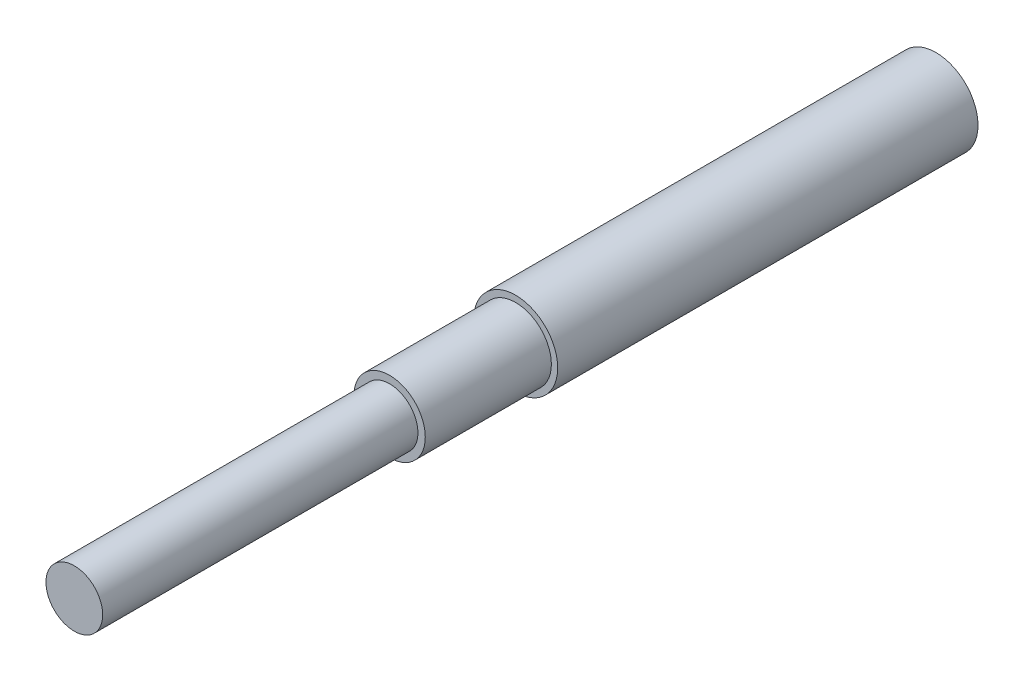
ISO-10303-21;
HEADER;
FILE_DESCRIPTION(('STEP AP214'),'2;1');
FILE_NAME('part.step','',(''),(''),'','','');
FILE_SCHEMA(('AUTOMOTIVE_DESIGN { 1 0 10303 214 1 1 1 1 }'));
ENDSEC;
DATA;
#1=APPLICATION_CONTEXT('core data for automotive mechanical design processes');
#2=APPLICATION_PROTOCOL_DEFINITION('international standard','automotive_design',2000,#1);
#3=PRODUCT_CONTEXT('',#1,'mechanical');
#4=PRODUCT('Part','Part','',(#3));
#5=PRODUCT_RELATED_PRODUCT_CATEGORY('part','',(#4));
#6=PRODUCT_DEFINITION_FORMATION('','',#4);
#7=PRODUCT_DEFINITION_CONTEXT('part definition',#1,'design');
#8=PRODUCT_DEFINITION('design','',#6,#7);
#9=PRODUCT_DEFINITION_SHAPE('','',#8);
#10=(LENGTH_UNIT() NAMED_UNIT(*) SI_UNIT(.MILLI.,.METRE.));
#11=(NAMED_UNIT(*) PLANE_ANGLE_UNIT() SI_UNIT($,.RADIAN.));
#12=(NAMED_UNIT(*) SI_UNIT($,.STERADIAN.) SOLID_ANGLE_UNIT());
#13=UNCERTAINTY_MEASURE_WITH_UNIT(LENGTH_MEASURE(1.E-05),#10,'distance_accuracy_value','');
#14=(GEOMETRIC_REPRESENTATION_CONTEXT(3) GLOBAL_UNCERTAINTY_ASSIGNED_CONTEXT((#13)) GLOBAL_UNIT_ASSIGNED_CONTEXT((#10,
#11,#12)) REPRESENTATION_CONTEXT('',''));
#15=CARTESIAN_POINT('',(0.,0.,0.));
#16=DIRECTION('',(0.,0.,1.));
#17=DIRECTION('',(1.,0.,0.));
#18=AXIS2_PLACEMENT_3D('',#15,#16,#17);
#19=CARTESIAN_POINT('',(0.,0.,20.));
#20=DIRECTION('',(0.,0.,-1.));
#21=DIRECTION('',(-1.,0.,0.));
#22=AXIS2_PLACEMENT_3D('',#19,#20,#21);
#23=CYLINDRICAL_SURFACE('',#22,2.);
#24=CARTESIAN_POINT('',(0.,0.,20.));
#25=DIRECTION('',(0.,0.,1.));
#26=DIRECTION('',(1.,0.,0.));
#27=AXIS2_PLACEMENT_3D('',#24,#25,#26);
#28=CIRCLE('',#27,2.);
#29=CARTESIAN_POINT('',(2.,0.,20.));
#30=VERTEX_POINT('',#29);
#31=EDGE_CURVE('E45',#30,#30,#28,.T.);
#32=ORIENTED_EDGE('',*,*,#31,.F.);
#33=EDGE_LOOP('',(#32));
#34=FACE_BOUND('',#33,.T.);
#35=CARTESIAN_POINT('',(0.,0.,0.));
#36=DIRECTION('',(0.,0.,1.));
#37=DIRECTION('',(1.,0.,0.));
#38=AXIS2_PLACEMENT_3D('',#35,#36,#37);
#39=CIRCLE('',#38,2.);
#40=CARTESIAN_POINT('',(2.,0.,0.));
#41=VERTEX_POINT('',#40);
#42=EDGE_CURVE('E36',#41,#41,#39,.T.);
#43=ORIENTED_EDGE('',*,*,#42,.T.);
#44=EDGE_LOOP('',(#43));
#45=FACE_BOUND('',#44,.T.);
#46=ADVANCED_FACE('F33',(#34,#45),#23,.T.);
#47=CARTESIAN_POINT('',(0.,0.,20.));
#48=DIRECTION('',(0.,0.,1.));
#49=DIRECTION('',(1.,0.,0.));
#50=AXIS2_PLACEMENT_3D('',#47,#48,#49);
#51=PLANE('',#50);
#52=CARTESIAN_POINT('',(0.,0.,20.));
#53=DIRECTION('',(0.,0.,1.));
#54=DIRECTION('',(1.,0.,0.));
#55=AXIS2_PLACEMENT_3D('',#52,#53,#54);
#56=CIRCLE('',#55,1.7);
#57=CARTESIAN_POINT('',(1.7,0.,20.));
#58=VERTEX_POINT('',#57);
#59=EDGE_CURVE('E40',#58,#58,#56,.T.);
#60=ORIENTED_EDGE('',*,*,#59,.F.);
#61=EDGE_LOOP('',(#60));
#62=FACE_BOUND('',#61,.T.);
#63=ORIENTED_EDGE('',*,*,#31,.T.);
#64=EDGE_LOOP('',(#63));
#65=FACE_BOUND('',#64,.T.);
#66=ADVANCED_FACE('F62',(#62,#65),#51,.T.);
#67=CARTESIAN_POINT('',(0.,0.,0.));
#68=DIRECTION('',(0.,0.,1.));
#69=DIRECTION('',(1.,0.,0.));
#70=AXIS2_PLACEMENT_3D('',#67,#68,#69);
#71=PLANE('',#70);
#72=ORIENTED_EDGE('',*,*,#42,.F.);
#73=EDGE_LOOP('',(#72));
#74=FACE_BOUND('',#73,.T.);
#75=ADVANCED_FACE('F59',(#74),#71,.F.);
#76=CARTESIAN_POINT('',(0.,0.,26.));
#77=DIRECTION('',(0.,0.,-1.));
#78=DIRECTION('',(-1.,0.,0.));
#79=AXIS2_PLACEMENT_3D('',#76,#77,#78);
#80=CYLINDRICAL_SURFACE('',#79,1.7);
#81=CARTESIAN_POINT('',(0.,0.,26.));
#82=DIRECTION('',(0.,0.,1.));
#83=DIRECTION('',(1.,0.,0.));
#84=AXIS2_PLACEMENT_3D('',#81,#82,#83);
#85=CIRCLE('',#84,1.7);
#86=CARTESIAN_POINT('',(1.7,0.,26.));
#87=VERTEX_POINT('',#86);
#88=EDGE_CURVE('E50',#87,#87,#85,.T.);
#89=ORIENTED_EDGE('',*,*,#88,.F.);
#90=EDGE_LOOP('',(#89));
#91=FACE_BOUND('',#90,.T.);
#92=ORIENTED_EDGE('',*,*,#59,.T.);
#93=EDGE_LOOP('',(#92));
#94=FACE_BOUND('',#93,.T.);
#95=ADVANCED_FACE('F61',(#91,#94),#80,.T.);
#96=CARTESIAN_POINT('',(0.,0.,26.));
#97=DIRECTION('',(0.,0.,1.));
#98=DIRECTION('',(1.,0.,0.));
#99=AXIS2_PLACEMENT_3D('',#96,#97,#98);
#100=PLANE('',#99);
#101=CARTESIAN_POINT('',(0.,0.,26.));
#102=DIRECTION('',(0.,0.,1.));
#103=DIRECTION('',(1.,0.,0.));
#104=AXIS2_PLACEMENT_3D('',#101,#102,#103);
#105=CIRCLE('',#104,1.35);
#106=CARTESIAN_POINT('',(1.35,0.,26.));
#107=VERTEX_POINT('',#106);
#108=EDGE_CURVE('E10',#107,#107,#105,.T.);
#109=ORIENTED_EDGE('',*,*,#108,.F.);
#110=EDGE_LOOP('',(#109));
#111=FACE_BOUND('',#110,.T.);
#112=ORIENTED_EDGE('',*,*,#88,.T.);
#113=EDGE_LOOP('',(#112));
#114=FACE_BOUND('',#113,.T.);
#115=ADVANCED_FACE('F67',(#111,#114),#100,.T.);
#116=CARTESIAN_POINT('',(0.,0.,41.));
#117=DIRECTION('',(0.,0.,-1.));
#118=DIRECTION('',(-1.,0.,0.));
#119=AXIS2_PLACEMENT_3D('',#116,#117,#118);
#120=CYLINDRICAL_SURFACE('',#119,1.35);
#121=CARTESIAN_POINT('',(0.,0.,41.));
#122=DIRECTION('',(0.,0.,1.));
#123=DIRECTION('',(1.,0.,0.));
#124=AXIS2_PLACEMENT_3D('',#121,#122,#123);
#125=CIRCLE('',#124,1.35);
#126=CARTESIAN_POINT('',(1.35,0.,41.));
#127=VERTEX_POINT('',#126);
#128=EDGE_CURVE('E49',#127,#127,#125,.T.);
#129=ORIENTED_EDGE('',*,*,#128,.F.);
#130=EDGE_LOOP('',(#129));
#131=FACE_BOUND('',#130,.T.);
#132=ORIENTED_EDGE('',*,*,#108,.T.);
#133=EDGE_LOOP('',(#132));
#134=FACE_BOUND('',#133,.T.);
#135=ADVANCED_FACE('F97',(#131,#134),#120,.T.);
#136=CARTESIAN_POINT('',(0.,0.,41.));
#137=DIRECTION('',(0.,0.,1.));
#138=DIRECTION('',(1.,0.,0.));
#139=AXIS2_PLACEMENT_3D('',#136,#137,#138);
#140=PLANE('',#139);
#141=ORIENTED_EDGE('',*,*,#128,.T.);
#142=EDGE_LOOP('',(#141));
#143=FACE_BOUND('',#142,.T.);
#144=ADVANCED_FACE('F108',(#143),#140,.T.);
#145=CLOSED_SHELL('',(#46,#66,#75,#95,#115,#135,#144));
#146=MANIFOLD_SOLID_BREP('B2',#145);
#147=ADVANCED_BREP_SHAPE_REPRESENTATION('',(#18,#146),#14);
#148=SHAPE_DEFINITION_REPRESENTATION(#9,#147);
ENDSEC;
END-ISO-10303-21;
